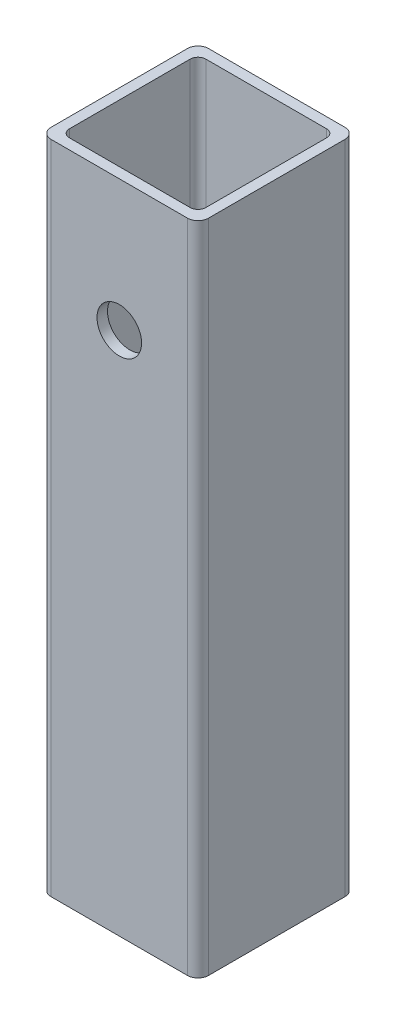
ISO-10303-21;
HEADER;
FILE_DESCRIPTION(('STEP AP214'),'2;1');
FILE_NAME('part.step','',(''),(''),'','','');
FILE_SCHEMA(('AUTOMOTIVE_DESIGN { 1 0 10303 214 1 1 1 1 }'));
ENDSEC;
DATA;
#1=APPLICATION_CONTEXT('core data for automotive mechanical design processes');
#2=APPLICATION_PROTOCOL_DEFINITION('international standard','automotive_design',2000,#1);
#3=PRODUCT_CONTEXT('',#1,'mechanical');
#4=PRODUCT('Part','Part','',(#3));
#5=PRODUCT_RELATED_PRODUCT_CATEGORY('part','',(#4));
#6=PRODUCT_DEFINITION_FORMATION('','',#4);
#7=PRODUCT_DEFINITION_CONTEXT('part definition',#1,'design');
#8=PRODUCT_DEFINITION('design','',#6,#7);
#9=PRODUCT_DEFINITION_SHAPE('','',#8);
#10=(LENGTH_UNIT() NAMED_UNIT(*) SI_UNIT(.MILLI.,.METRE.));
#11=(NAMED_UNIT(*) PLANE_ANGLE_UNIT() SI_UNIT($,.RADIAN.));
#12=(NAMED_UNIT(*) SI_UNIT($,.STERADIAN.) SOLID_ANGLE_UNIT());
#13=UNCERTAINTY_MEASURE_WITH_UNIT(LENGTH_MEASURE(1.E-05),#10,'distance_accuracy_value','');
#14=(GEOMETRIC_REPRESENTATION_CONTEXT(3) GLOBAL_UNCERTAINTY_ASSIGNED_CONTEXT((#13)) GLOBAL_UNIT_ASSIGNED_CONTEXT((#10,
#11,#12)) REPRESENTATION_CONTEXT('',''));
#15=CARTESIAN_POINT('',(0.,0.,0.));
#16=DIRECTION('',(0.,0.,1.));
#17=DIRECTION('',(1.,0.,0.));
#18=AXIS2_PLACEMENT_3D('',#15,#16,#17);
#19=CARTESIAN_POINT('',(-56.,-150.,55.9999999999995));
#20=DIRECTION('',(0.,1.,0.));
#21=DIRECTION('',(0.,0.,1.));
#22=AXIS2_PLACEMENT_3D('',#19,#20,#21);
#23=CYLINDRICAL_SURFACE('',#22,4.);
#24=DIRECTION('',(0.,1.,0.));
#25=VECTOR('',#24,1.);
#26=CARTESIAN_POINT('',(-56.,-150.,59.9999999999995));
#27=LINE('',#26,#25);
#28=CARTESIAN_POINT('',(-56.,-150.,59.9999999999995));
#29=VERTEX_POINT('',#28);
#30=CARTESIAN_POINT('',(-56.,100.,59.9999999999995));
#31=VERTEX_POINT('',#30);
#32=EDGE_CURVE('E269',#29,#31,#27,.T.);
#33=ORIENTED_EDGE('',*,*,#32,.T.);
#34=CARTESIAN_POINT('',(-56.,100.,55.9999999999995));
#35=DIRECTION('',(0.,1.,0.));
#36=DIRECTION('',(0.,0.,1.));
#37=AXIS2_PLACEMENT_3D('',#34,#35,#36);
#38=CIRCLE('',#37,4.);
#39=CARTESIAN_POINT('',(-60.,100.,55.9999999999995));
#40=VERTEX_POINT('',#39);
#41=EDGE_CURVE('E193',#40,#31,#38,.T.);
#42=ORIENTED_EDGE('',*,*,#41,.F.);
#43=DIRECTION('',(0.,1.,0.));
#44=VECTOR('',#43,1.);
#45=CARTESIAN_POINT('',(-60.,-150.,55.9999999999995));
#46=LINE('',#45,#44);
#47=CARTESIAN_POINT('',(-60.,-150.,55.9999999999995));
#48=VERTEX_POINT('',#47);
#49=EDGE_CURVE('E11',#48,#40,#46,.T.);
#50=ORIENTED_EDGE('',*,*,#49,.F.);
#51=CARTESIAN_POINT('',(-56.,-150.,55.9999999999995));
#52=DIRECTION('',(0.,1.,0.));
#53=DIRECTION('',(0.,0.,1.));
#54=AXIS2_PLACEMENT_3D('',#51,#52,#53);
#55=CIRCLE('',#54,4.);
#56=EDGE_CURVE('E236',#48,#29,#55,.T.);
#57=ORIENTED_EDGE('',*,*,#56,.T.);
#58=EDGE_LOOP('',(#33,#42,#50,#57));
#59=FACE_BOUND('',#58,.T.);
#60=ADVANCED_FACE('F35',(#59),#23,.T.);
#61=CARTESIAN_POINT('',(-60.,-150.,3.99999999999955));
#62=DIRECTION('',(-1.,0.,0.));
#63=DIRECTION('',(0.,0.,1.));
#64=AXIS2_PLACEMENT_3D('',#61,#62,#63);
#65=PLANE('',#64);
#66=ORIENTED_EDGE('',*,*,#49,.T.);
#67=DIRECTION('',(0.,0.,1.));
#68=VECTOR('',#67,1.);
#69=CARTESIAN_POINT('',(-60.,100.,3.99999999999955));
#70=LINE('',#69,#68);
#71=CARTESIAN_POINT('',(-60.,100.,3.99999999999955));
#72=VERTEX_POINT('',#71);
#73=EDGE_CURVE('E214',#72,#40,#70,.T.);
#74=ORIENTED_EDGE('',*,*,#73,.F.);
#75=DIRECTION('',(0.,1.,0.));
#76=VECTOR('',#75,1.);
#77=CARTESIAN_POINT('',(-60.,-150.,3.99999999999955));
#78=LINE('',#77,#76);
#79=CARTESIAN_POINT('',(-60.,-150.,3.99999999999955));
#80=VERTEX_POINT('',#79);
#81=EDGE_CURVE('E43',#80,#72,#78,.T.);
#82=ORIENTED_EDGE('',*,*,#81,.F.);
#83=DIRECTION('',(0.,0.,1.));
#84=VECTOR('',#83,1.);
#85=CARTESIAN_POINT('',(-60.,-150.,3.99999999999955));
#86=LINE('',#85,#84);
#87=EDGE_CURVE('E267',#80,#48,#86,.T.);
#88=ORIENTED_EDGE('',*,*,#87,.T.);
#89=EDGE_LOOP('',(#66,#74,#82,#88));
#90=FACE_BOUND('',#89,.T.);
#91=ADVANCED_FACE('F290',(#90),#65,.T.);
#92=CARTESIAN_POINT('',(-56.,-150.,3.99999999999955));
#93=DIRECTION('',(0.,1.,0.));
#94=DIRECTION('',(0.,0.,1.));
#95=AXIS2_PLACEMENT_3D('',#92,#93,#94);
#96=CYLINDRICAL_SURFACE('',#95,4.);
#97=ORIENTED_EDGE('',*,*,#81,.T.);
#98=CARTESIAN_POINT('',(-56.,100.,3.99999999999955));
#99=DIRECTION('',(0.,1.,0.));
#100=DIRECTION('',(0.,0.,1.));
#101=AXIS2_PLACEMENT_3D('',#98,#99,#100);
#102=CIRCLE('',#101,4.);
#103=CARTESIAN_POINT('',(-56.,100.,-4.49293380277993E-13));
#104=VERTEX_POINT('',#103);
#105=EDGE_CURVE('E211',#104,#72,#102,.T.);
#106=ORIENTED_EDGE('',*,*,#105,.F.);
#107=DIRECTION('',(0.,1.,0.));
#108=VECTOR('',#107,1.);
#109=CARTESIAN_POINT('',(-56.,-150.,-4.49293380277993E-13));
#110=LINE('',#109,#108);
#111=CARTESIAN_POINT('',(-56.,-150.,-4.49293380277993E-13));
#112=VERTEX_POINT('',#111);
#113=EDGE_CURVE('E272',#112,#104,#110,.T.);
#114=ORIENTED_EDGE('',*,*,#113,.F.);
#115=CARTESIAN_POINT('',(-56.,-150.,3.99999999999955));
#116=DIRECTION('',(0.,1.,0.));
#117=DIRECTION('',(0.,0.,1.));
#118=AXIS2_PLACEMENT_3D('',#115,#116,#117);
#119=CIRCLE('',#118,4.);
#120=EDGE_CURVE('E264',#112,#80,#119,.T.);
#121=ORIENTED_EDGE('',*,*,#120,.T.);
#122=EDGE_LOOP('',(#97,#106,#114,#121));
#123=FACE_BOUND('',#122,.T.);
#124=ADVANCED_FACE('F311',(#123),#96,.T.);
#125=CARTESIAN_POINT('',(-56.,-150.,-4.5102810375397E-13));
#126=DIRECTION('',(0.,0.,-1.));
#127=DIRECTION('',(-1.,0.,0.));
#128=AXIS2_PLACEMENT_3D('',#125,#126,#127);
#129=PLANE('',#128);
#130=CARTESIAN_POINT('',(-30.,50.,-4.5102810375397E-13));
#131=DIRECTION('',(0.,0.,1.));
#132=DIRECTION('',(1.,0.,0.));
#133=AXIS2_PLACEMENT_3D('',#130,#131,#132);
#134=CIRCLE('',#133,8.5);
#135=CARTESIAN_POINT('',(-21.5,50.,-4.5102810375397E-13));
#136=VERTEX_POINT('',#135);
#137=EDGE_CURVE('E481',#136,#136,#134,.T.);
#138=ORIENTED_EDGE('',*,*,#137,.T.);
#139=EDGE_LOOP('',(#138));
#140=FACE_BOUND('',#139,.T.);
#141=ORIENTED_EDGE('',*,*,#113,.T.);
#142=DIRECTION('',(-1.,0.,0.));
#143=VECTOR('',#142,1.);
#144=CARTESIAN_POINT('',(-56.,100.,-4.5102810375397E-13));
#145=LINE('',#144,#143);
#146=CARTESIAN_POINT('',(-4.,100.,-4.5102810375397E-13));
#147=VERTEX_POINT('',#146);
#148=EDGE_CURVE('E208',#147,#104,#145,.T.);
#149=ORIENTED_EDGE('',*,*,#148,.F.);
#150=DIRECTION('',(0.,1.,0.));
#151=VECTOR('',#150,1.);
#152=CARTESIAN_POINT('',(-4.,-150.,-4.5102810375397E-13));
#153=LINE('',#152,#151);
#154=CARTESIAN_POINT('',(-4.,-150.,-4.5102810375397E-13));
#155=VERTEX_POINT('',#154);
#156=EDGE_CURVE('E274',#155,#147,#153,.T.);
#157=ORIENTED_EDGE('',*,*,#156,.F.);
#158=DIRECTION('',(-1.,0.,0.));
#159=VECTOR('',#158,1.);
#160=CARTESIAN_POINT('',(-56.,-150.,-4.5102810375397E-13));
#161=LINE('',#160,#159);
#162=EDGE_CURVE('E261',#155,#112,#161,.T.);
#163=ORIENTED_EDGE('',*,*,#162,.T.);
#164=EDGE_LOOP('',(#141,#149,#157,#163));
#165=FACE_BOUND('',#164,.T.);
#166=ADVANCED_FACE('F308',(#140,#165),#129,.T.);
#167=CARTESIAN_POINT('',(-4.,-150.,3.99999999999955));
#168=DIRECTION('',(0.,1.,0.));
#169=DIRECTION('',(0.,0.,1.));
#170=AXIS2_PLACEMENT_3D('',#167,#168,#169);
#171=CYLINDRICAL_SURFACE('',#170,4.);
#172=ORIENTED_EDGE('',*,*,#156,.T.);
#173=CARTESIAN_POINT('',(-4.,100.,3.99999999999955));
#174=DIRECTION('',(0.,1.,0.));
#175=DIRECTION('',(0.,0.,-1.));
#176=AXIS2_PLACEMENT_3D('',#173,#174,#175);
#177=CIRCLE('',#176,4.);
#178=CARTESIAN_POINT('',(0.,100.,3.99999999999955));
#179=VERTEX_POINT('',#178);
#180=EDGE_CURVE('E205',#179,#147,#177,.T.);
#181=ORIENTED_EDGE('',*,*,#180,.F.);
#182=DIRECTION('',(0.,1.,0.));
#183=VECTOR('',#182,1.);
#184=CARTESIAN_POINT('',(0.,-150.,3.99999999999955));
#185=LINE('',#184,#183);
#186=CARTESIAN_POINT('',(0.,-150.,3.99999999999955));
#187=VERTEX_POINT('',#186);
#188=EDGE_CURVE('E276',#187,#179,#185,.T.);
#189=ORIENTED_EDGE('',*,*,#188,.F.);
#190=CARTESIAN_POINT('',(-4.,-150.,3.99999999999955));
#191=DIRECTION('',(0.,1.,0.));
#192=DIRECTION('',(0.,0.,-1.));
#193=AXIS2_PLACEMENT_3D('',#190,#191,#192);
#194=CIRCLE('',#193,4.);
#195=EDGE_CURVE('E258',#187,#155,#194,.T.);
#196=ORIENTED_EDGE('',*,*,#195,.T.);
#197=EDGE_LOOP('',(#172,#181,#189,#196));
#198=FACE_BOUND('',#197,.T.);
#199=ADVANCED_FACE('F306',(#198),#171,.T.);
#200=CARTESIAN_POINT('',(0.,-150.,3.99999999999955));
#201=DIRECTION('',(1.,0.,0.));
#202=DIRECTION('',(0.,0.,-1.));
#203=AXIS2_PLACEMENT_3D('',#200,#201,#202);
#204=PLANE('',#203);
#205=ORIENTED_EDGE('',*,*,#188,.T.);
#206=DIRECTION('',(0.,0.,-1.));
#207=VECTOR('',#206,1.);
#208=CARTESIAN_POINT('',(0.,100.,3.99999999999955));
#209=LINE('',#208,#207);
#210=CARTESIAN_POINT('',(0.,100.,55.9999999999995));
#211=VERTEX_POINT('',#210);
#212=EDGE_CURVE('E202',#211,#179,#209,.T.);
#213=ORIENTED_EDGE('',*,*,#212,.F.);
#214=DIRECTION('',(0.,1.,0.));
#215=VECTOR('',#214,1.);
#216=CARTESIAN_POINT('',(0.,-150.,55.9999999999995));
#217=LINE('',#216,#215);
#218=CARTESIAN_POINT('',(0.,-150.,55.9999999999995));
#219=VERTEX_POINT('',#218);
#220=EDGE_CURVE('E278',#219,#211,#217,.T.);
#221=ORIENTED_EDGE('',*,*,#220,.F.);
#222=DIRECTION('',(0.,0.,-1.));
#223=VECTOR('',#222,1.);
#224=CARTESIAN_POINT('',(0.,-150.,3.99999999999955));
#225=LINE('',#224,#223);
#226=EDGE_CURVE('E255',#219,#187,#225,.T.);
#227=ORIENTED_EDGE('',*,*,#226,.T.);
#228=EDGE_LOOP('',(#205,#213,#221,#227));
#229=FACE_BOUND('',#228,.T.);
#230=ADVANCED_FACE('F304',(#229),#204,.T.);
#231=CARTESIAN_POINT('',(-4.,-150.,55.9999999999995));
#232=DIRECTION('',(0.,1.,0.));
#233=DIRECTION('',(0.,0.,1.));
#234=AXIS2_PLACEMENT_3D('',#231,#232,#233);
#235=CYLINDRICAL_SURFACE('',#234,4.);
#236=ORIENTED_EDGE('',*,*,#220,.T.);
#237=CARTESIAN_POINT('',(-4.,100.,55.9999999999995));
#238=DIRECTION('',(0.,1.,0.));
#239=DIRECTION('',(0.,0.,1.));
#240=AXIS2_PLACEMENT_3D('',#237,#238,#239);
#241=CIRCLE('',#240,4.);
#242=CARTESIAN_POINT('',(-4.,100.,59.9999999999995));
#243=VERTEX_POINT('',#242);
#244=EDGE_CURVE('E199',#243,#211,#241,.T.);
#245=ORIENTED_EDGE('',*,*,#244,.F.);
#246=DIRECTION('',(0.,1.,0.));
#247=VECTOR('',#246,1.);
#248=CARTESIAN_POINT('',(-4.,-150.,59.9999999999995));
#249=LINE('',#248,#247);
#250=CARTESIAN_POINT('',(-4.,-150.,59.9999999999995));
#251=VERTEX_POINT('',#250);
#252=EDGE_CURVE('E280',#251,#243,#249,.T.);
#253=ORIENTED_EDGE('',*,*,#252,.F.);
#254=CARTESIAN_POINT('',(-4.,-150.,55.9999999999995));
#255=DIRECTION('',(0.,1.,0.));
#256=DIRECTION('',(0.,0.,1.));
#257=AXIS2_PLACEMENT_3D('',#254,#255,#256);
#258=CIRCLE('',#257,4.);
#259=EDGE_CURVE('E252',#251,#219,#258,.T.);
#260=ORIENTED_EDGE('',*,*,#259,.T.);
#261=EDGE_LOOP('',(#236,#245,#253,#260));
#262=FACE_BOUND('',#261,.T.);
#263=ADVANCED_FACE('F300',(#262),#235,.T.);
#264=CARTESIAN_POINT('',(-56.,-150.,59.9999999999995));
#265=DIRECTION('',(0.,0.,1.));
#266=DIRECTION('',(1.,0.,0.));
#267=AXIS2_PLACEMENT_3D('',#264,#265,#266);
#268=PLANE('',#267);
#269=CARTESIAN_POINT('',(-30.,50.,59.9999999999995));
#270=DIRECTION('',(0.,0.,1.));
#271=DIRECTION('',(1.,0.,0.));
#272=AXIS2_PLACEMENT_3D('',#269,#270,#271);
#273=CIRCLE('',#272,8.5);
#274=CARTESIAN_POINT('',(-21.5,50.,59.9999999999995));
#275=VERTEX_POINT('',#274);
#276=EDGE_CURVE('E486',#275,#275,#273,.T.);
#277=ORIENTED_EDGE('',*,*,#276,.F.);
#278=EDGE_LOOP('',(#277));
#279=FACE_BOUND('',#278,.T.);
#280=ORIENTED_EDGE('',*,*,#252,.T.);
#281=DIRECTION('',(1.,0.,0.));
#282=VECTOR('',#281,1.);
#283=CARTESIAN_POINT('',(-56.,100.,59.9999999999995));
#284=LINE('',#283,#282);
#285=EDGE_CURVE('E196',#31,#243,#284,.T.);
#286=ORIENTED_EDGE('',*,*,#285,.F.);
#287=ORIENTED_EDGE('',*,*,#32,.F.);
#288=DIRECTION('',(1.,0.,0.));
#289=VECTOR('',#288,1.);
#290=CARTESIAN_POINT('',(-56.,-150.,59.9999999999995));
#291=LINE('',#290,#289);
#292=EDGE_CURVE('E249',#29,#251,#291,.T.);
#293=ORIENTED_EDGE('',*,*,#292,.T.);
#294=EDGE_LOOP('',(#280,#286,#287,#293));
#295=FACE_BOUND('',#294,.T.);
#296=ADVANCED_FACE('F284',(#279,#295),#268,.T.);
#297=CARTESIAN_POINT('',(-56.,-150.,55.9999999999995));
#298=DIRECTION('',(0.,1.,0.));
#299=DIRECTION('',(0.,0.,1.));
#300=AXIS2_PLACEMENT_3D('',#297,#298,#299);
#301=PLANE('',#300);
#302=DIRECTION('',(0.,0.,1.));
#303=VECTOR('',#302,1.);
#304=CARTESIAN_POINT('',(-56.,-150.,6.99999999999953));
#305=LINE('',#304,#303);
#306=CARTESIAN_POINT('',(-56.,-150.,6.99999999999953));
#307=VERTEX_POINT('',#306);
#308=CARTESIAN_POINT('',(-56.,-150.,52.9999999999996));
#309=VERTEX_POINT('',#308);
#310=EDGE_CURVE('E160',#307,#309,#305,.T.);
#311=ORIENTED_EDGE('',*,*,#310,.T.);
#312=CARTESIAN_POINT('',(-53.,-150.,52.9999999999996));
#313=DIRECTION('',(0.,1.,0.));
#314=DIRECTION('',(0.,0.,1.));
#315=AXIS2_PLACEMENT_3D('',#312,#313,#314);
#316=CIRCLE('',#315,2.99999999999999);
#317=CARTESIAN_POINT('',(-53.,-150.,55.9999999999996));
#318=VERTEX_POINT('',#317);
#319=EDGE_CURVE('E217',#309,#318,#316,.T.);
#320=ORIENTED_EDGE('',*,*,#319,.T.);
#321=DIRECTION('',(1.,0.,0.));
#322=VECTOR('',#321,1.);
#323=CARTESIAN_POINT('',(-53.,-150.,55.9999999999996));
#324=LINE('',#323,#322);
#325=CARTESIAN_POINT('',(-7.,-150.,55.9999999999996));
#326=VERTEX_POINT('',#325);
#327=EDGE_CURVE('E155',#318,#326,#324,.T.);
#328=ORIENTED_EDGE('',*,*,#327,.T.);
#329=CARTESIAN_POINT('',(-7.,-150.,52.9999999999996));
#330=DIRECTION('',(0.,1.,0.));
#331=DIRECTION('',(0.,0.,1.));
#332=AXIS2_PLACEMENT_3D('',#329,#330,#331);
#333=CIRCLE('',#332,2.99999999999999);
#334=CARTESIAN_POINT('',(-4.00000000000001,-150.,52.9999999999996));
#335=VERTEX_POINT('',#334);
#336=EDGE_CURVE('E51',#326,#335,#333,.T.);
#337=ORIENTED_EDGE('',*,*,#336,.T.);
#338=DIRECTION('',(0.,0.,-1.));
#339=VECTOR('',#338,1.);
#340=CARTESIAN_POINT('',(-4.00000000000001,-150.,6.99999999999953));
#341=LINE('',#340,#339);
#342=CARTESIAN_POINT('',(-4.,-150.,6.99999999999953));
#343=VERTEX_POINT('',#342);
#344=EDGE_CURVE('E221',#335,#343,#341,.T.);
#345=ORIENTED_EDGE('',*,*,#344,.T.);
#346=CARTESIAN_POINT('',(-7.,-150.,6.99999999999953));
#347=DIRECTION('',(0.,1.,0.));
#348=DIRECTION('',(0.,0.,-1.));
#349=AXIS2_PLACEMENT_3D('',#346,#347,#348);
#350=CIRCLE('',#349,3.);
#351=CARTESIAN_POINT('',(-7.,-150.,3.99999999999954));
#352=VERTEX_POINT('',#351);
#353=EDGE_CURVE('E224',#343,#352,#350,.T.);
#354=ORIENTED_EDGE('',*,*,#353,.T.);
#355=DIRECTION('',(-1.,0.,0.));
#356=VECTOR('',#355,1.);
#357=CARTESIAN_POINT('',(-53.,-150.,3.99999999999954));
#358=LINE('',#357,#356);
#359=CARTESIAN_POINT('',(-53.,-150.,3.99999999999954));
#360=VERTEX_POINT('',#359);
#361=EDGE_CURVE('E227',#352,#360,#358,.T.);
#362=ORIENTED_EDGE('',*,*,#361,.T.);
#363=CARTESIAN_POINT('',(-53.,-150.,6.99999999999953));
#364=DIRECTION('',(0.,1.,0.));
#365=DIRECTION('',(0.,0.,1.));
#366=AXIS2_PLACEMENT_3D('',#363,#364,#365);
#367=CIRCLE('',#366,3.);
#368=EDGE_CURVE('E230',#360,#307,#367,.T.);
#369=ORIENTED_EDGE('',*,*,#368,.T.);
#370=EDGE_LOOP('',(#311,#320,#328,#337,#345,#354,#362,#369));
#371=FACE_BOUND('',#370,.T.);
#372=ORIENTED_EDGE('',*,*,#56,.F.);
#373=ORIENTED_EDGE('',*,*,#87,.F.);
#374=ORIENTED_EDGE('',*,*,#120,.F.);
#375=ORIENTED_EDGE('',*,*,#162,.F.);
#376=ORIENTED_EDGE('',*,*,#195,.F.);
#377=ORIENTED_EDGE('',*,*,#226,.F.);
#378=ORIENTED_EDGE('',*,*,#259,.F.);
#379=ORIENTED_EDGE('',*,*,#292,.F.);
#380=EDGE_LOOP('',(#372,#373,#374,#375,#376,#377,#378,#379));
#381=FACE_BOUND('',#380,.T.);
#382=ADVANCED_FACE('F294',(#371,#381),#301,.F.);
#383=CARTESIAN_POINT('',(-53.,-150.,52.9999999999996));
#384=DIRECTION('',(0.,1.,0.));
#385=DIRECTION('',(0.,0.,1.));
#386=AXIS2_PLACEMENT_3D('',#383,#384,#385);
#387=CYLINDRICAL_SURFACE('',#386,2.99999999999999);
#388=DIRECTION('',(0.,1.,0.));
#389=VECTOR('',#388,1.);
#390=CARTESIAN_POINT('',(-56.,-150.,52.9999999999996));
#391=LINE('',#390,#389);
#392=CARTESIAN_POINT('',(-56.,100.,52.9999999999996));
#393=VERTEX_POINT('',#392);
#394=EDGE_CURVE('E165',#309,#393,#391,.T.);
#395=ORIENTED_EDGE('',*,*,#394,.T.);
#396=CARTESIAN_POINT('',(-53.,100.,52.9999999999996));
#397=DIRECTION('',(0.,1.,0.));
#398=DIRECTION('',(0.,0.,1.));
#399=AXIS2_PLACEMENT_3D('',#396,#397,#398);
#400=CIRCLE('',#399,2.99999999999999);
#401=CARTESIAN_POINT('',(-53.,100.,55.9999999999996));
#402=VERTEX_POINT('',#401);
#403=EDGE_CURVE('E163',#393,#402,#400,.T.);
#404=ORIENTED_EDGE('',*,*,#403,.T.);
#405=DIRECTION('',(0.,1.,0.));
#406=VECTOR('',#405,1.);
#407=CARTESIAN_POINT('',(-53.,-150.,55.9999999999996));
#408=LINE('',#407,#406);
#409=EDGE_CURVE('E148',#318,#402,#408,.T.);
#410=ORIENTED_EDGE('',*,*,#409,.F.);
#411=ORIENTED_EDGE('',*,*,#319,.F.);
#412=EDGE_LOOP('',(#395,#404,#410,#411));
#413=FACE_BOUND('',#412,.T.);
#414=ADVANCED_FACE('F164',(#413),#387,.F.);
#415=CARTESIAN_POINT('',(-56.,-150.,6.99999999999953));
#416=DIRECTION('',(-1.,0.,0.));
#417=DIRECTION('',(0.,0.,1.));
#418=AXIS2_PLACEMENT_3D('',#415,#416,#417);
#419=PLANE('',#418);
#420=DIRECTION('',(0.,1.,0.));
#421=VECTOR('',#420,1.);
#422=CARTESIAN_POINT('',(-56.,-150.,6.99999999999953));
#423=LINE('',#422,#421);
#424=CARTESIAN_POINT('',(-56.,100.,6.99999999999953));
#425=VERTEX_POINT('',#424);
#426=EDGE_CURVE('E237',#307,#425,#423,.T.);
#427=ORIENTED_EDGE('',*,*,#426,.T.);
#428=DIRECTION('',(0.,0.,1.));
#429=VECTOR('',#428,1.);
#430=CARTESIAN_POINT('',(-56.,100.,6.99999999999953));
#431=LINE('',#430,#429);
#432=EDGE_CURVE('E191',#425,#393,#431,.T.);
#433=ORIENTED_EDGE('',*,*,#432,.T.);
#434=ORIENTED_EDGE('',*,*,#394,.F.);
#435=ORIENTED_EDGE('',*,*,#310,.F.);
#436=EDGE_LOOP('',(#427,#433,#434,#435));
#437=FACE_BOUND('',#436,.T.);
#438=ADVANCED_FACE('F378',(#437),#419,.F.);
#439=CARTESIAN_POINT('',(-53.,-150.,6.99999999999953));
#440=DIRECTION('',(0.,1.,0.));
#441=DIRECTION('',(0.,0.,1.));
#442=AXIS2_PLACEMENT_3D('',#439,#440,#441);
#443=CYLINDRICAL_SURFACE('',#442,3.);
#444=DIRECTION('',(0.,1.,0.));
#445=VECTOR('',#444,1.);
#446=CARTESIAN_POINT('',(-53.,-150.,3.99999999999954));
#447=LINE('',#446,#445);
#448=CARTESIAN_POINT('',(-53.,100.,3.99999999999954));
#449=VERTEX_POINT('',#448);
#450=EDGE_CURVE('E239',#360,#449,#447,.T.);
#451=ORIENTED_EDGE('',*,*,#450,.T.);
#452=CARTESIAN_POINT('',(-53.,100.,6.99999999999953));
#453=DIRECTION('',(0.,1.,0.));
#454=DIRECTION('',(0.,0.,1.));
#455=AXIS2_PLACEMENT_3D('',#452,#453,#454);
#456=CIRCLE('',#455,3.);
#457=EDGE_CURVE('E188',#449,#425,#456,.T.);
#458=ORIENTED_EDGE('',*,*,#457,.T.);
#459=ORIENTED_EDGE('',*,*,#426,.F.);
#460=ORIENTED_EDGE('',*,*,#368,.F.);
#461=EDGE_LOOP('',(#451,#458,#459,#460));
#462=FACE_BOUND('',#461,.T.);
#463=ADVANCED_FACE('F387',(#462),#443,.F.);
#464=CARTESIAN_POINT('',(-53.,-150.,3.99999999999954));
#465=DIRECTION('',(0.,0.,-1.));
#466=DIRECTION('',(-1.,0.,0.));
#467=AXIS2_PLACEMENT_3D('',#464,#465,#466);
#468=PLANE('',#467);
#469=CARTESIAN_POINT('',(-30.,50.,3.99999999999954));
#470=DIRECTION('',(0.,0.,-1.));
#471=DIRECTION('',(-1.,0.,0.));
#472=AXIS2_PLACEMENT_3D('',#469,#470,#471);
#473=CIRCLE('',#472,8.5);
#474=CARTESIAN_POINT('',(-38.5,50.,3.99999999999954));
#475=VERTEX_POINT('',#474);
#476=EDGE_CURVE('E169',#475,#475,#473,.T.);
#477=ORIENTED_EDGE('',*,*,#476,.T.);
#478=EDGE_LOOP('',(#477));
#479=FACE_BOUND('',#478,.T.);
#480=DIRECTION('',(0.,1.,0.));
#481=VECTOR('',#480,1.);
#482=CARTESIAN_POINT('',(-7.,-150.,3.99999999999954));
#483=LINE('',#482,#481);
#484=CARTESIAN_POINT('',(-7.,100.,3.99999999999954));
#485=VERTEX_POINT('',#484);
#486=EDGE_CURVE('E241',#352,#485,#483,.T.);
#487=ORIENTED_EDGE('',*,*,#486,.T.);
#488=DIRECTION('',(-1.,0.,0.));
#489=VECTOR('',#488,1.);
#490=CARTESIAN_POINT('',(-53.,100.,3.99999999999954));
#491=LINE('',#490,#489);
#492=EDGE_CURVE('E185',#485,#449,#491,.T.);
#493=ORIENTED_EDGE('',*,*,#492,.T.);
#494=ORIENTED_EDGE('',*,*,#450,.F.);
#495=ORIENTED_EDGE('',*,*,#361,.F.);
#496=EDGE_LOOP('',(#487,#493,#494,#495));
#497=FACE_BOUND('',#496,.T.);
#498=ADVANCED_FACE('F397',(#479,#497),#468,.F.);
#499=CARTESIAN_POINT('',(-7.,-150.,6.99999999999953));
#500=DIRECTION('',(0.,1.,0.));
#501=DIRECTION('',(0.,0.,1.));
#502=AXIS2_PLACEMENT_3D('',#499,#500,#501);
#503=CYLINDRICAL_SURFACE('',#502,3.);
#504=DIRECTION('',(0.,1.,0.));
#505=VECTOR('',#504,1.);
#506=CARTESIAN_POINT('',(-4.,-150.,6.99999999999953));
#507=LINE('',#506,#505);
#508=CARTESIAN_POINT('',(-4.,100.,6.99999999999953));
#509=VERTEX_POINT('',#508);
#510=EDGE_CURVE('E243',#343,#509,#507,.T.);
#511=ORIENTED_EDGE('',*,*,#510,.T.);
#512=CARTESIAN_POINT('',(-7.,100.,6.99999999999953));
#513=DIRECTION('',(0.,1.,0.));
#514=DIRECTION('',(0.,0.,-1.));
#515=AXIS2_PLACEMENT_3D('',#512,#513,#514);
#516=CIRCLE('',#515,3.);
#517=EDGE_CURVE('E182',#509,#485,#516,.T.);
#518=ORIENTED_EDGE('',*,*,#517,.T.);
#519=ORIENTED_EDGE('',*,*,#486,.F.);
#520=ORIENTED_EDGE('',*,*,#353,.F.);
#521=EDGE_LOOP('',(#511,#518,#519,#520));
#522=FACE_BOUND('',#521,.T.);
#523=ADVANCED_FACE('F405',(#522),#503,.F.);
#524=CARTESIAN_POINT('',(-4.00000000000001,-150.,6.99999999999953));
#525=DIRECTION('',(1.,0.,0.));
#526=DIRECTION('',(0.,0.,-1.));
#527=AXIS2_PLACEMENT_3D('',#524,#525,#526);
#528=PLANE('',#527);
#529=DIRECTION('',(0.,1.,0.));
#530=VECTOR('',#529,1.);
#531=CARTESIAN_POINT('',(-4.00000000000001,-150.,52.9999999999996));
#532=LINE('',#531,#530);
#533=CARTESIAN_POINT('',(-4.00000000000001,100.,52.9999999999996));
#534=VERTEX_POINT('',#533);
#535=EDGE_CURVE('E245',#335,#534,#532,.T.);
#536=ORIENTED_EDGE('',*,*,#535,.T.);
#537=DIRECTION('',(0.,0.,-1.));
#538=VECTOR('',#537,1.);
#539=CARTESIAN_POINT('',(-4.00000000000001,100.,6.99999999999953));
#540=LINE('',#539,#538);
#541=EDGE_CURVE('E176',#534,#509,#540,.T.);
#542=ORIENTED_EDGE('',*,*,#541,.T.);
#543=ORIENTED_EDGE('',*,*,#510,.F.);
#544=ORIENTED_EDGE('',*,*,#344,.F.);
#545=EDGE_LOOP('',(#536,#542,#543,#544));
#546=FACE_BOUND('',#545,.T.);
#547=ADVANCED_FACE('F410',(#546),#528,.F.);
#548=CARTESIAN_POINT('',(-7.,-150.,52.9999999999996));
#549=DIRECTION('',(0.,1.,0.));
#550=DIRECTION('',(0.,0.,1.));
#551=AXIS2_PLACEMENT_3D('',#548,#549,#550);
#552=CYLINDRICAL_SURFACE('',#551,2.99999999999999);
#553=DIRECTION('',(0.,1.,0.));
#554=VECTOR('',#553,1.);
#555=CARTESIAN_POINT('',(-7.,-150.,55.9999999999996));
#556=LINE('',#555,#554);
#557=CARTESIAN_POINT('',(-7.,100.,55.9999999999996));
#558=VERTEX_POINT('',#557);
#559=EDGE_CURVE('E159',#326,#558,#556,.T.);
#560=ORIENTED_EDGE('',*,*,#559,.T.);
#561=CARTESIAN_POINT('',(-7.,100.,52.9999999999996));
#562=DIRECTION('',(0.,1.,0.));
#563=DIRECTION('',(0.,0.,1.));
#564=AXIS2_PLACEMENT_3D('',#561,#562,#563);
#565=CIRCLE('',#564,2.99999999999999);
#566=EDGE_CURVE('E174',#558,#534,#565,.T.);
#567=ORIENTED_EDGE('',*,*,#566,.T.);
#568=ORIENTED_EDGE('',*,*,#535,.F.);
#569=ORIENTED_EDGE('',*,*,#336,.F.);
#570=EDGE_LOOP('',(#560,#567,#568,#569));
#571=FACE_BOUND('',#570,.T.);
#572=ADVANCED_FACE('F420',(#571),#552,.F.);
#573=CARTESIAN_POINT('',(-53.,-150.,55.9999999999996));
#574=DIRECTION('',(0.,0.,1.));
#575=DIRECTION('',(1.,0.,0.));
#576=AXIS2_PLACEMENT_3D('',#573,#574,#575);
#577=PLANE('',#576);
#578=CARTESIAN_POINT('',(-30.,50.,55.9999999999996));
#579=DIRECTION('',(0.,0.,1.));
#580=DIRECTION('',(1.,0.,0.));
#581=AXIS2_PLACEMENT_3D('',#578,#579,#580);
#582=CIRCLE('',#581,8.5);
#583=CARTESIAN_POINT('',(-21.5,50.,55.9999999999996));
#584=VERTEX_POINT('',#583);
#585=EDGE_CURVE('E38',#584,#584,#582,.T.);
#586=ORIENTED_EDGE('',*,*,#585,.T.);
#587=EDGE_LOOP('',(#586));
#588=FACE_BOUND('',#587,.T.);
#589=ORIENTED_EDGE('',*,*,#409,.T.);
#590=DIRECTION('',(1.,0.,0.));
#591=VECTOR('',#590,1.);
#592=CARTESIAN_POINT('',(-53.,100.,55.9999999999996));
#593=LINE('',#592,#591);
#594=EDGE_CURVE('E152',#402,#558,#593,.T.);
#595=ORIENTED_EDGE('',*,*,#594,.T.);
#596=ORIENTED_EDGE('',*,*,#559,.F.);
#597=ORIENTED_EDGE('',*,*,#327,.F.);
#598=EDGE_LOOP('',(#589,#595,#596,#597));
#599=FACE_BOUND('',#598,.T.);
#600=ADVANCED_FACE('F150',(#588,#599),#577,.F.);
#601=CARTESIAN_POINT('',(-56.,100.,55.9999999999995));
#602=DIRECTION('',(0.,1.,0.));
#603=DIRECTION('',(0.,0.,1.));
#604=AXIS2_PLACEMENT_3D('',#601,#602,#603);
#605=PLANE('',#604);
#606=ORIENTED_EDGE('',*,*,#41,.T.);
#607=ORIENTED_EDGE('',*,*,#285,.T.);
#608=ORIENTED_EDGE('',*,*,#244,.T.);
#609=ORIENTED_EDGE('',*,*,#212,.T.);
#610=ORIENTED_EDGE('',*,*,#180,.T.);
#611=ORIENTED_EDGE('',*,*,#148,.T.);
#612=ORIENTED_EDGE('',*,*,#105,.T.);
#613=ORIENTED_EDGE('',*,*,#73,.T.);
#614=EDGE_LOOP('',(#606,#607,#608,#609,#610,#611,#612,#613));
#615=FACE_BOUND('',#614,.T.);
#616=ORIENTED_EDGE('',*,*,#594,.F.);
#617=ORIENTED_EDGE('',*,*,#403,.F.);
#618=ORIENTED_EDGE('',*,*,#432,.F.);
#619=ORIENTED_EDGE('',*,*,#457,.F.);
#620=ORIENTED_EDGE('',*,*,#492,.F.);
#621=ORIENTED_EDGE('',*,*,#517,.F.);
#622=ORIENTED_EDGE('',*,*,#541,.F.);
#623=ORIENTED_EDGE('',*,*,#566,.F.);
#624=EDGE_LOOP('',(#616,#617,#618,#619,#620,#621,#622,#623));
#625=FACE_BOUND('',#624,.T.);
#626=ADVANCED_FACE('F171',(#615,#625),#605,.T.);
#627=CARTESIAN_POINT('',(-30.,50.,-4.5102810375397E-13));
#628=DIRECTION('',(0.,0.,1.));
#629=DIRECTION('',(1.,0.,0.));
#630=AXIS2_PLACEMENT_3D('',#627,#628,#629);
#631=CYLINDRICAL_SURFACE('',#630,8.5);
#632=ORIENTED_EDGE('',*,*,#276,.T.);
#633=EDGE_LOOP('',(#632));
#634=FACE_BOUND('',#633,.T.);
#635=ORIENTED_EDGE('',*,*,#585,.F.);
#636=EDGE_LOOP('',(#635));
#637=FACE_BOUND('',#636,.T.);
#638=ADVANCED_FACE('F439',(#634,#637),#631,.F.);
#639=ORIENTED_EDGE('',*,*,#137,.F.);
#640=EDGE_LOOP('',(#639));
#641=FACE_BOUND('',#640,.T.);
#642=ORIENTED_EDGE('',*,*,#476,.F.);
#643=EDGE_LOOP('',(#642));
#644=FACE_BOUND('',#643,.T.);
#645=ADVANCED_FACE('F465',(#641,#644),#631,.F.);
#646=CLOSED_SHELL('',(#60,#91,#124,#166,#199,#230,#263,#296,#382,#414,#438,#463,#498,#523,#547,
#572,#600,#626,#638,#645));
#647=MANIFOLD_SOLID_BREP('B2',#646);
#648=ADVANCED_BREP_SHAPE_REPRESENTATION('',(#18,#647),#14);
#649=SHAPE_DEFINITION_REPRESENTATION(#9,#648);
ENDSEC;
END-ISO-10303-21;
